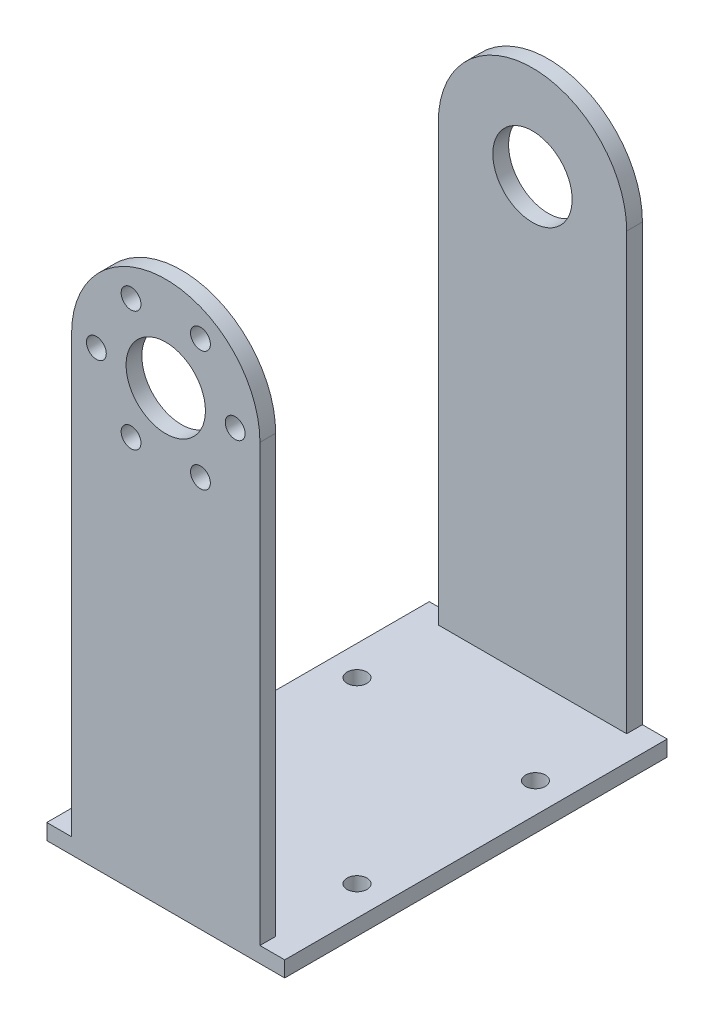
ISO-10303-21;
HEADER;
FILE_DESCRIPTION(('STEP AP214'),'2;1');
FILE_NAME('part.step','',(''),(''),'','','');
FILE_SCHEMA(('AUTOMOTIVE_DESIGN { 1 0 10303 214 1 1 1 1 }'));
ENDSEC;
DATA;
#1=APPLICATION_CONTEXT('core data for automotive mechanical design processes');
#2=APPLICATION_PROTOCOL_DEFINITION('international standard','automotive_design',2000,#1);
#3=PRODUCT_CONTEXT('',#1,'mechanical');
#4=PRODUCT('Part','Part','',(#3));
#5=PRODUCT_RELATED_PRODUCT_CATEGORY('part','',(#4));
#6=PRODUCT_DEFINITION_FORMATION('','',#4);
#7=PRODUCT_DEFINITION_CONTEXT('part definition',#1,'design');
#8=PRODUCT_DEFINITION('design','',#6,#7);
#9=PRODUCT_DEFINITION_SHAPE('','',#8);
#10=(LENGTH_UNIT() NAMED_UNIT(*) SI_UNIT(.MILLI.,.METRE.));
#11=(NAMED_UNIT(*) PLANE_ANGLE_UNIT() SI_UNIT($,.RADIAN.));
#12=(NAMED_UNIT(*) SI_UNIT($,.STERADIAN.) SOLID_ANGLE_UNIT());
#13=UNCERTAINTY_MEASURE_WITH_UNIT(LENGTH_MEASURE(1.E-05),#10,'distance_accuracy_value','');
#14=(GEOMETRIC_REPRESENTATION_CONTEXT(3) GLOBAL_UNCERTAINTY_ASSIGNED_CONTEXT((#13)) GLOBAL_UNIT_ASSIGNED_CONTEXT((#10,
#11,#12)) REPRESENTATION_CONTEXT('',''));
#15=CARTESIAN_POINT('',(0.,0.,0.));
#16=DIRECTION('',(0.,0.,1.));
#17=DIRECTION('',(1.,0.,0.));
#18=AXIS2_PLACEMENT_3D('',#15,#16,#17);
#19=CARTESIAN_POINT('',(0.,1.5875,0.));
#20=DIRECTION('',(0.,-1.,0.));
#21=DIRECTION('',(0.,0.,-1.));
#22=AXIS2_PLACEMENT_3D('',#19,#20,#21);
#23=PLANE('',#22);
#24=CARTESIAN_POINT('',(-9.,1.5875,9.));
#25=DIRECTION('',(0.,1.,0.));
#26=DIRECTION('',(0.,0.,1.));
#27=AXIS2_PLACEMENT_3D('',#24,#25,#26);
#28=CIRCLE('',#27,1.);
#29=CARTESIAN_POINT('',(-9.,1.5875,10.));
#30=VERTEX_POINT('',#29);
#31=EDGE_CURVE('E544',#30,#30,#28,.T.);
#32=ORIENTED_EDGE('',*,*,#31,.F.);
#33=EDGE_LOOP('',(#32));
#34=FACE_BOUND('',#33,.T.);
#35=CARTESIAN_POINT('',(9.,1.5875,9.));
#36=DIRECTION('',(0.,1.,0.));
#37=DIRECTION('',(0.,0.,1.));
#38=AXIS2_PLACEMENT_3D('',#35,#36,#37);
#39=CIRCLE('',#38,1.);
#40=CARTESIAN_POINT('',(9.,1.5875,10.));
#41=VERTEX_POINT('',#40);
#42=EDGE_CURVE('E546',#41,#41,#39,.T.);
#43=ORIENTED_EDGE('',*,*,#42,.F.);
#44=EDGE_LOOP('',(#43));
#45=FACE_BOUND('',#44,.T.);
#46=CARTESIAN_POINT('',(9.,1.5875,-9.));
#47=DIRECTION('',(0.,1.,0.));
#48=DIRECTION('',(0.,0.,1.));
#49=AXIS2_PLACEMENT_3D('',#46,#47,#48);
#50=CIRCLE('',#49,1.);
#51=CARTESIAN_POINT('',(9.,1.5875,-8.));
#52=VERTEX_POINT('',#51);
#53=EDGE_CURVE('E552',#52,#52,#50,.T.);
#54=ORIENTED_EDGE('',*,*,#53,.F.);
#55=EDGE_LOOP('',(#54));
#56=FACE_BOUND('',#55,.T.);
#57=CARTESIAN_POINT('',(-9.,1.5875,-9.));
#58=DIRECTION('',(0.,1.,0.));
#59=DIRECTION('',(0.,0.,1.));
#60=AXIS2_PLACEMENT_3D('',#57,#58,#59);
#61=CIRCLE('',#60,1.);
#62=CARTESIAN_POINT('',(-9.,1.5875,-8.));
#63=VERTEX_POINT('',#62);
#64=EDGE_CURVE('E558',#63,#63,#61,.T.);
#65=ORIENTED_EDGE('',*,*,#64,.F.);
#66=EDGE_LOOP('',(#65));
#67=FACE_BOUND('',#66,.T.);
#68=DIRECTION('',(1.,0.,0.));
#69=VECTOR('',#68,1.);
#70=CARTESIAN_POINT('',(0.,1.5875,-17.7025));
#71=LINE('',#70,#69);
#72=CARTESIAN_POINT('',(-9.50473763600357,1.5875,-17.7025));
#73=VERTEX_POINT('',#72);
#74=CARTESIAN_POINT('',(9.5,1.5875,-17.7025));
#75=VERTEX_POINT('',#74);
#76=EDGE_CURVE('E58',#73,#75,#71,.T.);
#77=ORIENTED_EDGE('',*,*,#76,.F.);
#78=DIRECTION('',(0.,0.,-1.));
#79=VECTOR('',#78,1.);
#80=CARTESIAN_POINT('',(-9.50473763600357,1.5875,-17.7025));
#81=LINE('',#80,#79);
#82=CARTESIAN_POINT('',(-9.50473763600357,1.5875,-19.29));
#83=VERTEX_POINT('',#82);
#84=EDGE_CURVE('E147',#73,#83,#81,.T.);
#85=ORIENTED_EDGE('',*,*,#84,.T.);
#86=DIRECTION('',(-1.,0.,0.));
#87=VECTOR('',#86,1.);
#88=CARTESIAN_POINT('',(-12.,1.5875,-19.29));
#89=LINE('',#88,#87);
#90=CARTESIAN_POINT('',(-12.,1.5875,-19.29));
#91=VERTEX_POINT('',#90);
#92=EDGE_CURVE('E296',#83,#91,#89,.T.);
#93=ORIENTED_EDGE('',*,*,#92,.T.);
#94=DIRECTION('',(0.,0.,1.));
#95=VECTOR('',#94,1.);
#96=CARTESIAN_POINT('',(-12.,1.5875,19.29));
#97=LINE('',#96,#95);
#98=CARTESIAN_POINT('',(-12.,1.5875,19.29));
#99=VERTEX_POINT('',#98);
#100=EDGE_CURVE('E255',#91,#99,#97,.T.);
#101=ORIENTED_EDGE('',*,*,#100,.T.);
#102=DIRECTION('',(1.,0.,0.));
#103=VECTOR('',#102,1.);
#104=CARTESIAN_POINT('',(-12.,1.5875,19.29));
#105=LINE('',#104,#103);
#106=CARTESIAN_POINT('',(-9.5,1.5875,19.29));
#107=VERTEX_POINT('',#106);
#108=EDGE_CURVE('E254',#99,#107,#105,.T.);
#109=ORIENTED_EDGE('',*,*,#108,.T.);
#110=DIRECTION('',(0.,0.,1.));
#111=VECTOR('',#110,1.);
#112=CARTESIAN_POINT('',(-9.5,1.5875,17.7025));
#113=LINE('',#112,#111);
#114=CARTESIAN_POINT('',(-9.5,1.5875,17.7025));
#115=VERTEX_POINT('',#114);
#116=EDGE_CURVE('E237',#115,#107,#113,.T.);
#117=ORIENTED_EDGE('',*,*,#116,.F.);
#118=DIRECTION('',(-1.,0.,0.));
#119=VECTOR('',#118,1.);
#120=CARTESIAN_POINT('',(0.,1.5875,17.7025));
#121=LINE('',#120,#119);
#122=CARTESIAN_POINT('',(9.5,1.5875,17.7025));
#123=VERTEX_POINT('',#122);
#124=EDGE_CURVE('E193',#123,#115,#121,.T.);
#125=ORIENTED_EDGE('',*,*,#124,.F.);
#126=DIRECTION('',(0.,0.,1.));
#127=VECTOR('',#126,1.);
#128=CARTESIAN_POINT('',(9.5,1.5875,17.7025));
#129=LINE('',#128,#127);
#130=CARTESIAN_POINT('',(9.5,1.5875,19.29));
#131=VERTEX_POINT('',#130);
#132=EDGE_CURVE('E229',#123,#131,#129,.T.);
#133=ORIENTED_EDGE('',*,*,#132,.T.);
#134=CARTESIAN_POINT('',(12.,1.5875,19.29));
#135=VERTEX_POINT('',#134);
#136=EDGE_CURVE('E251',#131,#135,#105,.T.);
#137=ORIENTED_EDGE('',*,*,#136,.T.);
#138=DIRECTION('',(0.,0.,-1.));
#139=VECTOR('',#138,1.);
#140=CARTESIAN_POINT('',(12.,1.5875,19.29));
#141=LINE('',#140,#139);
#142=CARTESIAN_POINT('',(12.,1.5875,-19.29));
#143=VERTEX_POINT('',#142);
#144=EDGE_CURVE('E269',#135,#143,#141,.T.);
#145=ORIENTED_EDGE('',*,*,#144,.T.);
#146=CARTESIAN_POINT('',(9.5,1.5875,-19.29));
#147=VERTEX_POINT('',#146);
#148=EDGE_CURVE('E297',#143,#147,#89,.T.);
#149=ORIENTED_EDGE('',*,*,#148,.T.);
#150=DIRECTION('',(0.,0.,-1.));
#151=VECTOR('',#150,1.);
#152=CARTESIAN_POINT('',(9.5,1.5875,-17.7025));
#153=LINE('',#152,#151);
#154=EDGE_CURVE('E53',#75,#147,#153,.T.);
#155=ORIENTED_EDGE('',*,*,#154,.F.);
#156=EDGE_LOOP('',(#77,#85,#93,#101,#109,#117,#125,#133,#137,#145,#149,#155));
#157=FACE_BOUND('',#156,.T.);
#158=ADVANCED_FACE('F36',(#34,#45,#56,#67,#157),#23,.F.);
#159=CARTESIAN_POINT('',(12.,1.5875,19.29));
#160=DIRECTION('',(-1.,0.,0.));
#161=DIRECTION('',(0.,0.,1.));
#162=AXIS2_PLACEMENT_3D('',#159,#160,#161);
#163=PLANE('',#162);
#164=DIRECTION('',(0.,0.,-1.));
#165=VECTOR('',#164,1.);
#166=CARTESIAN_POINT('',(12.,0.,19.29));
#167=LINE('',#166,#165);
#168=CARTESIAN_POINT('',(12.,0.,19.29));
#169=VERTEX_POINT('',#168);
#170=CARTESIAN_POINT('',(12.,0.,-19.29));
#171=VERTEX_POINT('',#170);
#172=EDGE_CURVE('E228',#169,#171,#167,.T.);
#173=ORIENTED_EDGE('',*,*,#172,.T.);
#174=DIRECTION('',(0.,-1.,0.));
#175=VECTOR('',#174,1.);
#176=CARTESIAN_POINT('',(12.,1.5875,-19.29));
#177=LINE('',#176,#175);
#178=EDGE_CURVE('E11',#143,#171,#177,.T.);
#179=ORIENTED_EDGE('',*,*,#178,.F.);
#180=ORIENTED_EDGE('',*,*,#144,.F.);
#181=DIRECTION('',(0.,-1.,0.));
#182=VECTOR('',#181,1.);
#183=CARTESIAN_POINT('',(12.,1.5875,19.29));
#184=LINE('',#183,#182);
#185=EDGE_CURVE('E270',#135,#169,#184,.T.);
#186=ORIENTED_EDGE('',*,*,#185,.T.);
#187=EDGE_LOOP('',(#173,#179,#180,#186));
#188=FACE_BOUND('',#187,.T.);
#189=ADVANCED_FACE('F38',(#188),#163,.F.);
#190=CARTESIAN_POINT('',(-12.,1.5875,-19.29));
#191=DIRECTION('',(0.,0.,1.));
#192=DIRECTION('',(1.,0.,0.));
#193=AXIS2_PLACEMENT_3D('',#190,#191,#192);
#194=PLANE('',#193);
#195=DIRECTION('',(-1.,0.,0.));
#196=VECTOR('',#195,1.);
#197=CARTESIAN_POINT('',(-12.,0.,-19.29));
#198=LINE('',#197,#196);
#199=CARTESIAN_POINT('',(-12.,0.,-19.29));
#200=VERTEX_POINT('',#199);
#201=EDGE_CURVE('E263',#171,#200,#198,.T.);
#202=ORIENTED_EDGE('',*,*,#201,.T.);
#203=DIRECTION('',(0.,-1.,0.));
#204=VECTOR('',#203,1.);
#205=CARTESIAN_POINT('',(-12.,1.5875,-19.29));
#206=LINE('',#205,#204);
#207=EDGE_CURVE('E45',#91,#200,#206,.T.);
#208=ORIENTED_EDGE('',*,*,#207,.F.);
#209=ORIENTED_EDGE('',*,*,#92,.F.);
#210=DIRECTION('',(0.,1.,0.));
#211=VECTOR('',#210,1.);
#212=CARTESIAN_POINT('',(-9.50473763600357,0.,-19.29));
#213=LINE('',#212,#211);
#214=CARTESIAN_POINT('',(-9.50473763600357,45.5,-19.29));
#215=VERTEX_POINT('',#214);
#216=EDGE_CURVE('E160',#83,#215,#213,.T.);
#217=ORIENTED_EDGE('',*,*,#216,.T.);
#218=CARTESIAN_POINT('',(-0.00236881800178522,45.5,-19.29));
#219=DIRECTION('',(0.,0.,-1.));
#220=DIRECTION('',(-1.,0.,0.));
#221=AXIS2_PLACEMENT_3D('',#218,#219,#220);
#222=CIRCLE('',#221,9.50236881800178);
#223=CARTESIAN_POINT('',(9.5,45.5,-19.29));
#224=VERTEX_POINT('',#223);
#225=EDGE_CURVE('E132',#215,#224,#222,.T.);
#226=ORIENTED_EDGE('',*,*,#225,.T.);
#227=DIRECTION('',(0.,1.,0.));
#228=VECTOR('',#227,1.);
#229=CARTESIAN_POINT('',(9.5,0.,-19.29));
#230=LINE('',#229,#228);
#231=EDGE_CURVE('E151',#147,#224,#230,.T.);
#232=ORIENTED_EDGE('',*,*,#231,.F.);
#233=ORIENTED_EDGE('',*,*,#148,.F.);
#234=ORIENTED_EDGE('',*,*,#178,.T.);
#235=EDGE_LOOP('',(#202,#208,#209,#217,#226,#232,#233,#234));
#236=FACE_BOUND('',#235,.T.);
#237=CARTESIAN_POINT('',(-0.00236881800178522,45.5,-19.29));
#238=DIRECTION('',(0.,0.,-1.));
#239=DIRECTION('',(-1.,0.,0.));
#240=AXIS2_PLACEMENT_3D('',#237,#238,#239);
#241=CIRCLE('',#240,4.);
#242=CARTESIAN_POINT('',(-4.00236881800179,45.5,-19.29));
#243=VERTEX_POINT('',#242);
#244=EDGE_CURVE('E157',#243,#243,#241,.T.);
#245=ORIENTED_EDGE('',*,*,#244,.F.);
#246=EDGE_LOOP('',(#245));
#247=FACE_BOUND('',#246,.T.);
#248=ADVANCED_FACE('F330',(#236,#247),#194,.F.);
#249=CARTESIAN_POINT('',(-12.,1.5875,19.29));
#250=DIRECTION('',(1.,0.,0.));
#251=DIRECTION('',(0.,0.,-1.));
#252=AXIS2_PLACEMENT_3D('',#249,#250,#251);
#253=PLANE('',#252);
#254=DIRECTION('',(0.,0.,1.));
#255=VECTOR('',#254,1.);
#256=CARTESIAN_POINT('',(-12.,0.,19.29));
#257=LINE('',#256,#255);
#258=CARTESIAN_POINT('',(-12.,0.,19.29));
#259=VERTEX_POINT('',#258);
#260=EDGE_CURVE('E265',#200,#259,#257,.T.);
#261=ORIENTED_EDGE('',*,*,#260,.T.);
#262=DIRECTION('',(0.,-1.,0.));
#263=VECTOR('',#262,1.);
#264=CARTESIAN_POINT('',(-12.,1.5875,19.29));
#265=LINE('',#264,#263);
#266=EDGE_CURVE('E273',#99,#259,#265,.T.);
#267=ORIENTED_EDGE('',*,*,#266,.F.);
#268=ORIENTED_EDGE('',*,*,#100,.F.);
#269=ORIENTED_EDGE('',*,*,#207,.T.);
#270=EDGE_LOOP('',(#261,#267,#268,#269));
#271=FACE_BOUND('',#270,.T.);
#272=ADVANCED_FACE('F281',(#271),#253,.F.);
#273=CARTESIAN_POINT('',(-12.,1.5875,19.29));
#274=DIRECTION('',(0.,0.,-1.));
#275=DIRECTION('',(-1.,0.,0.));
#276=AXIS2_PLACEMENT_3D('',#273,#274,#275);
#277=PLANE('',#276);
#278=DIRECTION('',(1.,0.,0.));
#279=VECTOR('',#278,1.);
#280=CARTESIAN_POINT('',(-12.,0.,19.29));
#281=LINE('',#280,#279);
#282=EDGE_CURVE('E267',#259,#169,#281,.T.);
#283=ORIENTED_EDGE('',*,*,#282,.T.);
#284=ORIENTED_EDGE('',*,*,#185,.F.);
#285=ORIENTED_EDGE('',*,*,#136,.F.);
#286=DIRECTION('',(0.,1.,0.));
#287=VECTOR('',#286,1.);
#288=CARTESIAN_POINT('',(9.5,0.,19.29));
#289=LINE('',#288,#287);
#290=CARTESIAN_POINT('',(9.5,45.5430013413392,19.29));
#291=VERTEX_POINT('',#290);
#292=EDGE_CURVE('E225',#131,#291,#289,.T.);
#293=ORIENTED_EDGE('',*,*,#292,.T.);
#294=CARTESIAN_POINT('',(0.,45.5430013413392,19.29));
#295=DIRECTION('',(0.,0.,1.));
#296=DIRECTION('',(1.,0.,0.));
#297=AXIS2_PLACEMENT_3D('',#294,#295,#296);
#298=CIRCLE('',#297,9.5);
#299=CARTESIAN_POINT('',(-9.5,45.5430013413392,19.29));
#300=VERTEX_POINT('',#299);
#301=EDGE_CURVE('E219',#300,#291,#298,.F.);
#302=ORIENTED_EDGE('',*,*,#301,.F.);
#303=DIRECTION('',(0.,1.,0.));
#304=VECTOR('',#303,1.);
#305=CARTESIAN_POINT('',(-9.5,0.,19.29));
#306=LINE('',#305,#304);
#307=EDGE_CURVE('E222',#107,#300,#306,.T.);
#308=ORIENTED_EDGE('',*,*,#307,.F.);
#309=ORIENTED_EDGE('',*,*,#108,.F.);
#310=ORIENTED_EDGE('',*,*,#266,.T.);
#311=EDGE_LOOP('',(#283,#284,#285,#293,#302,#308,#309,#310));
#312=FACE_BOUND('',#311,.T.);
#313=CARTESIAN_POINT('',(3.49999999999992,39.4808235148481,19.29));
#314=DIRECTION('',(0.,0.,1.));
#315=DIRECTION('',(1.,0.,0.));
#316=AXIS2_PLACEMENT_3D('',#313,#314,#315);
#317=CIRCLE('',#316,1.00000000000001);
#318=CARTESIAN_POINT('',(4.49999999999993,39.4808235148481,19.29));
#319=VERTEX_POINT('',#318);
#320=EDGE_CURVE('E167',#319,#319,#317,.T.);
#321=ORIENTED_EDGE('',*,*,#320,.F.);
#322=EDGE_LOOP('',(#321));
#323=FACE_BOUND('',#322,.T.);
#324=CARTESIAN_POINT('',(7.,45.5430013413392,19.29));
#325=DIRECTION('',(0.,0.,1.));
#326=DIRECTION('',(1.,0.,0.));
#327=AXIS2_PLACEMENT_3D('',#324,#325,#326);
#328=CIRCLE('',#327,1.);
#329=CARTESIAN_POINT('',(8.,45.5430013413392,19.29));
#330=VERTEX_POINT('',#329);
#331=EDGE_CURVE('E204',#330,#330,#328,.T.);
#332=ORIENTED_EDGE('',*,*,#331,.F.);
#333=EDGE_LOOP('',(#332));
#334=FACE_BOUND('',#333,.T.);
#335=CARTESIAN_POINT('',(3.50000000000005,51.6051791678303,19.29));
#336=DIRECTION('',(0.,0.,1.));
#337=DIRECTION('',(1.,0.,0.));
#338=AXIS2_PLACEMENT_3D('',#335,#336,#337);
#339=CIRCLE('',#338,1.);
#340=CARTESIAN_POINT('',(4.50000000000005,51.6051791678303,19.29));
#341=VERTEX_POINT('',#340);
#342=EDGE_CURVE('E207',#341,#341,#339,.T.);
#343=ORIENTED_EDGE('',*,*,#342,.F.);
#344=EDGE_LOOP('',(#343));
#345=FACE_BOUND('',#344,.T.);
#346=CARTESIAN_POINT('',(-3.49999999999997,51.6051791678303,19.29));
#347=DIRECTION('',(0.,0.,1.));
#348=DIRECTION('',(1.,0.,0.));
#349=AXIS2_PLACEMENT_3D('',#346,#347,#348);
#350=CIRCLE('',#349,1.);
#351=CARTESIAN_POINT('',(-2.49999999999997,51.6051791678303,19.29));
#352=VERTEX_POINT('',#351);
#353=EDGE_CURVE('E210',#352,#352,#350,.T.);
#354=ORIENTED_EDGE('',*,*,#353,.F.);
#355=EDGE_LOOP('',(#354));
#356=FACE_BOUND('',#355,.T.);
#357=CARTESIAN_POINT('',(-7.00000000000001,45.5430013413393,19.29));
#358=DIRECTION('',(0.,0.,1.));
#359=DIRECTION('',(1.,0.,0.));
#360=AXIS2_PLACEMENT_3D('',#357,#358,#359);
#361=CIRCLE('',#360,1.00000000000001);
#362=CARTESIAN_POINT('',(-6.,45.5430013413393,19.29));
#363=VERTEX_POINT('',#362);
#364=EDGE_CURVE('E213',#363,#363,#361,.T.);
#365=ORIENTED_EDGE('',*,*,#364,.F.);
#366=EDGE_LOOP('',(#365));
#367=FACE_BOUND('',#366,.T.);
#368=CARTESIAN_POINT('',(-3.5,39.4808235148482,19.29));
#369=DIRECTION('',(0.,0.,1.));
#370=DIRECTION('',(1.,0.,0.));
#371=AXIS2_PLACEMENT_3D('',#368,#369,#370);
#372=CIRCLE('',#371,0.999999999999999);
#373=CARTESIAN_POINT('',(-2.5,39.4808235148482,19.29));
#374=VERTEX_POINT('',#373);
#375=EDGE_CURVE('E216',#374,#374,#372,.T.);
#376=ORIENTED_EDGE('',*,*,#375,.F.);
#377=EDGE_LOOP('',(#376));
#378=FACE_BOUND('',#377,.T.);
#379=CARTESIAN_POINT('',(0.,45.5430013413392,19.29));
#380=DIRECTION('',(0.,0.,1.));
#381=DIRECTION('',(1.,0.,0.));
#382=AXIS2_PLACEMENT_3D('',#379,#380,#381);
#383=CIRCLE('',#382,4.);
#384=CARTESIAN_POINT('',(4.,45.5430013413392,19.29));
#385=VERTEX_POINT('',#384);
#386=EDGE_CURVE('E174',#385,#385,#383,.T.);
#387=ORIENTED_EDGE('',*,*,#386,.F.);
#388=EDGE_LOOP('',(#387));
#389=FACE_BOUND('',#388,.T.);
#390=ADVANCED_FACE('F289',(#312,#323,#334,#345,#356,#367,#378,#389),#277,.F.);
#391=CARTESIAN_POINT('',(0.,0.,0.));
#392=DIRECTION('',(0.,-1.,0.));
#393=DIRECTION('',(0.,0.,-1.));
#394=AXIS2_PLACEMENT_3D('',#391,#392,#393);
#395=PLANE('',#394);
#396=CARTESIAN_POINT('',(-9.,0.,9.));
#397=DIRECTION('',(0.,1.,0.));
#398=DIRECTION('',(0.,0.,1.));
#399=AXIS2_PLACEMENT_3D('',#396,#397,#398);
#400=CIRCLE('',#399,1.);
#401=CARTESIAN_POINT('',(-9.,0.,10.));
#402=VERTEX_POINT('',#401);
#403=EDGE_CURVE('E542',#402,#402,#400,.T.);
#404=ORIENTED_EDGE('',*,*,#403,.T.);
#405=EDGE_LOOP('',(#404));
#406=FACE_BOUND('',#405,.T.);
#407=CARTESIAN_POINT('',(9.,0.,9.));
#408=DIRECTION('',(0.,1.,0.));
#409=DIRECTION('',(0.,0.,1.));
#410=AXIS2_PLACEMENT_3D('',#407,#408,#409);
#411=CIRCLE('',#410,1.);
#412=CARTESIAN_POINT('',(9.,0.,10.));
#413=VERTEX_POINT('',#412);
#414=EDGE_CURVE('E549',#413,#413,#411,.T.);
#415=ORIENTED_EDGE('',*,*,#414,.T.);
#416=EDGE_LOOP('',(#415));
#417=FACE_BOUND('',#416,.T.);
#418=CARTESIAN_POINT('',(9.,0.,-9.));
#419=DIRECTION('',(0.,1.,0.));
#420=DIRECTION('',(0.,0.,1.));
#421=AXIS2_PLACEMENT_3D('',#418,#419,#420);
#422=CIRCLE('',#421,1.);
#423=CARTESIAN_POINT('',(9.,0.,-8.));
#424=VERTEX_POINT('',#423);
#425=EDGE_CURVE('E555',#424,#424,#422,.T.);
#426=ORIENTED_EDGE('',*,*,#425,.T.);
#427=EDGE_LOOP('',(#426));
#428=FACE_BOUND('',#427,.T.);
#429=CARTESIAN_POINT('',(-9.,0.,-9.));
#430=DIRECTION('',(0.,1.,0.));
#431=DIRECTION('',(0.,0.,1.));
#432=AXIS2_PLACEMENT_3D('',#429,#430,#431);
#433=CIRCLE('',#432,1.);
#434=CARTESIAN_POINT('',(-9.,0.,-8.));
#435=VERTEX_POINT('',#434);
#436=EDGE_CURVE('E161',#435,#435,#433,.T.);
#437=ORIENTED_EDGE('',*,*,#436,.T.);
#438=EDGE_LOOP('',(#437));
#439=FACE_BOUND('',#438,.T.);
#440=ORIENTED_EDGE('',*,*,#172,.F.);
#441=ORIENTED_EDGE('',*,*,#282,.F.);
#442=ORIENTED_EDGE('',*,*,#260,.F.);
#443=ORIENTED_EDGE('',*,*,#201,.F.);
#444=EDGE_LOOP('',(#440,#441,#442,#443));
#445=FACE_BOUND('',#444,.T.);
#446=ADVANCED_FACE('F287',(#406,#417,#428,#439,#445),#395,.T.);
#447=CARTESIAN_POINT('',(0.,45.5430013413392,17.7025));
#448=DIRECTION('',(0.,0.,1.));
#449=DIRECTION('',(1.,0.,0.));
#450=AXIS2_PLACEMENT_3D('',#447,#448,#449);
#451=CYLINDRICAL_SURFACE('',#450,9.5);
#452=ORIENTED_EDGE('',*,*,#301,.T.);
#453=DIRECTION('',(0.,0.,1.));
#454=VECTOR('',#453,1.);
#455=CARTESIAN_POINT('',(9.5,45.5430013413392,17.7025));
#456=LINE('',#455,#454);
#457=CARTESIAN_POINT('',(9.5,45.5430013413392,17.7025));
#458=VERTEX_POINT('',#457);
#459=EDGE_CURVE('E226',#458,#291,#456,.T.);
#460=ORIENTED_EDGE('',*,*,#459,.F.);
#461=CARTESIAN_POINT('',(0.,45.5430013413392,17.7025));
#462=DIRECTION('',(0.,0.,1.));
#463=DIRECTION('',(1.,0.,0.));
#464=AXIS2_PLACEMENT_3D('',#461,#462,#463);
#465=CIRCLE('',#464,9.5);
#466=CARTESIAN_POINT('',(-9.5,45.5430013413392,17.7025));
#467=VERTEX_POINT('',#466);
#468=EDGE_CURVE('E189',#467,#458,#465,.F.);
#469=ORIENTED_EDGE('',*,*,#468,.F.);
#470=DIRECTION('',(0.,0.,1.));
#471=VECTOR('',#470,1.);
#472=CARTESIAN_POINT('',(-9.5,45.5430013413392,17.7025));
#473=LINE('',#472,#471);
#474=EDGE_CURVE('E201',#467,#300,#473,.T.);
#475=ORIENTED_EDGE('',*,*,#474,.T.);
#476=EDGE_LOOP('',(#452,#460,#469,#475));
#477=FACE_BOUND('',#476,.T.);
#478=ADVANCED_FACE('F303',(#477),#451,.T.);
#479=CARTESIAN_POINT('',(9.5,0.,17.7025));
#480=DIRECTION('',(1.,0.,0.));
#481=DIRECTION('',(0.,0.,-1.));
#482=AXIS2_PLACEMENT_3D('',#479,#480,#481);
#483=PLANE('',#482);
#484=ORIENTED_EDGE('',*,*,#292,.F.);
#485=ORIENTED_EDGE('',*,*,#132,.F.);
#486=DIRECTION('',(0.,1.,0.));
#487=VECTOR('',#486,1.);
#488=CARTESIAN_POINT('',(9.5,0.,17.7025));
#489=LINE('',#488,#487);
#490=EDGE_CURVE('E195',#123,#458,#489,.T.);
#491=ORIENTED_EDGE('',*,*,#490,.T.);
#492=ORIENTED_EDGE('',*,*,#459,.T.);
#493=EDGE_LOOP('',(#484,#485,#491,#492));
#494=FACE_BOUND('',#493,.T.);
#495=ADVANCED_FACE('F313',(#494),#483,.T.);
#496=CARTESIAN_POINT('',(-9.5,0.,17.7025));
#497=DIRECTION('',(1.,0.,0.));
#498=DIRECTION('',(0.,0.,-1.));
#499=AXIS2_PLACEMENT_3D('',#496,#497,#498);
#500=PLANE('',#499);
#501=ORIENTED_EDGE('',*,*,#307,.T.);
#502=ORIENTED_EDGE('',*,*,#474,.F.);
#503=DIRECTION('',(0.,1.,0.));
#504=VECTOR('',#503,1.);
#505=CARTESIAN_POINT('',(-9.5,0.,17.7025));
#506=LINE('',#505,#504);
#507=EDGE_CURVE('E191',#115,#467,#506,.T.);
#508=ORIENTED_EDGE('',*,*,#507,.F.);
#509=ORIENTED_EDGE('',*,*,#116,.T.);
#510=EDGE_LOOP('',(#501,#502,#508,#509));
#511=FACE_BOUND('',#510,.T.);
#512=ADVANCED_FACE('F306',(#511),#500,.F.);
#513=CARTESIAN_POINT('',(-3.5,39.4808235148482,17.7025));
#514=DIRECTION('',(0.,0.,1.));
#515=DIRECTION('',(1.,0.,0.));
#516=AXIS2_PLACEMENT_3D('',#513,#514,#515);
#517=CYLINDRICAL_SURFACE('',#516,0.999999999999999);
#518=CARTESIAN_POINT('',(-3.5,39.4808235148482,17.7025));
#519=DIRECTION('',(0.,0.,1.));
#520=DIRECTION('',(1.,0.,0.));
#521=AXIS2_PLACEMENT_3D('',#518,#519,#520);
#522=CIRCLE('',#521,0.999999999999999);
#523=CARTESIAN_POINT('',(-2.5,39.4808235148482,17.7025));
#524=VERTEX_POINT('',#523);
#525=EDGE_CURVE('E186',#524,#524,#522,.T.);
#526=ORIENTED_EDGE('',*,*,#525,.F.);
#527=EDGE_LOOP('',(#526));
#528=FACE_BOUND('',#527,.T.);
#529=ORIENTED_EDGE('',*,*,#375,.T.);
#530=EDGE_LOOP('',(#529));
#531=FACE_BOUND('',#530,.T.);
#532=ADVANCED_FACE('F320',(#528,#531),#517,.F.);
#533=CARTESIAN_POINT('',(-7.00000000000001,45.5430013413393,17.7025));
#534=DIRECTION('',(0.,0.,1.));
#535=DIRECTION('',(1.,0.,0.));
#536=AXIS2_PLACEMENT_3D('',#533,#534,#535);
#537=CYLINDRICAL_SURFACE('',#536,1.00000000000001);
#538=CARTESIAN_POINT('',(-7.00000000000001,45.5430013413393,17.7025));
#539=DIRECTION('',(0.,0.,1.));
#540=DIRECTION('',(1.,0.,0.));
#541=AXIS2_PLACEMENT_3D('',#538,#539,#540);
#542=CIRCLE('',#541,1.00000000000001);
#543=CARTESIAN_POINT('',(-6.,45.5430013413393,17.7025));
#544=VERTEX_POINT('',#543);
#545=EDGE_CURVE('E183',#544,#544,#542,.T.);
#546=ORIENTED_EDGE('',*,*,#545,.F.);
#547=EDGE_LOOP('',(#546));
#548=FACE_BOUND('',#547,.T.);
#549=ORIENTED_EDGE('',*,*,#364,.T.);
#550=EDGE_LOOP('',(#549));
#551=FACE_BOUND('',#550,.T.);
#552=ADVANCED_FACE('F398',(#548,#551),#537,.F.);
#553=CARTESIAN_POINT('',(-3.49999999999997,51.6051791678303,17.7025));
#554=DIRECTION('',(0.,0.,1.));
#555=DIRECTION('',(1.,0.,0.));
#556=AXIS2_PLACEMENT_3D('',#553,#554,#555);
#557=CYLINDRICAL_SURFACE('',#556,1.);
#558=CARTESIAN_POINT('',(-3.49999999999997,51.6051791678303,17.7025));
#559=DIRECTION('',(0.,0.,1.));
#560=DIRECTION('',(1.,0.,0.));
#561=AXIS2_PLACEMENT_3D('',#558,#559,#560);
#562=CIRCLE('',#561,1.);
#563=CARTESIAN_POINT('',(-2.49999999999997,51.6051791678303,17.7025));
#564=VERTEX_POINT('',#563);
#565=EDGE_CURVE('E180',#564,#564,#562,.T.);
#566=ORIENTED_EDGE('',*,*,#565,.F.);
#567=EDGE_LOOP('',(#566));
#568=FACE_BOUND('',#567,.T.);
#569=ORIENTED_EDGE('',*,*,#353,.T.);
#570=EDGE_LOOP('',(#569));
#571=FACE_BOUND('',#570,.T.);
#572=ADVANCED_FACE('F404',(#568,#571),#557,.F.);
#573=CARTESIAN_POINT('',(3.50000000000005,51.6051791678303,17.7025));
#574=DIRECTION('',(0.,0.,1.));
#575=DIRECTION('',(1.,0.,0.));
#576=AXIS2_PLACEMENT_3D('',#573,#574,#575);
#577=CYLINDRICAL_SURFACE('',#576,1.);
#578=CARTESIAN_POINT('',(3.50000000000005,51.6051791678303,17.7025));
#579=DIRECTION('',(0.,0.,1.));
#580=DIRECTION('',(1.,0.,0.));
#581=AXIS2_PLACEMENT_3D('',#578,#579,#580);
#582=CIRCLE('',#581,1.);
#583=CARTESIAN_POINT('',(4.50000000000005,51.6051791678303,17.7025));
#584=VERTEX_POINT('',#583);
#585=EDGE_CURVE('E177',#584,#584,#582,.T.);
#586=ORIENTED_EDGE('',*,*,#585,.F.);
#587=EDGE_LOOP('',(#586));
#588=FACE_BOUND('',#587,.T.);
#589=ORIENTED_EDGE('',*,*,#342,.T.);
#590=EDGE_LOOP('',(#589));
#591=FACE_BOUND('',#590,.T.);
#592=ADVANCED_FACE('F381',(#588,#591),#577,.F.);
#593=CARTESIAN_POINT('',(7.,45.5430013413392,17.7025));
#594=DIRECTION('',(0.,0.,1.));
#595=DIRECTION('',(1.,0.,0.));
#596=AXIS2_PLACEMENT_3D('',#593,#594,#595);
#597=CYLINDRICAL_SURFACE('',#596,1.);
#598=CARTESIAN_POINT('',(7.,45.5430013413392,17.7025));
#599=DIRECTION('',(0.,0.,1.));
#600=DIRECTION('',(1.,0.,0.));
#601=AXIS2_PLACEMENT_3D('',#598,#599,#600);
#602=CIRCLE('',#601,1.);
#603=CARTESIAN_POINT('',(8.,45.5430013413392,17.7025));
#604=VERTEX_POINT('',#603);
#605=EDGE_CURVE('E173',#604,#604,#602,.T.);
#606=ORIENTED_EDGE('',*,*,#605,.F.);
#607=EDGE_LOOP('',(#606));
#608=FACE_BOUND('',#607,.T.);
#609=ORIENTED_EDGE('',*,*,#331,.T.);
#610=EDGE_LOOP('',(#609));
#611=FACE_BOUND('',#610,.T.);
#612=ADVANCED_FACE('F372',(#608,#611),#597,.F.);
#613=CARTESIAN_POINT('',(3.49999999999992,39.4808235148481,17.7025));
#614=DIRECTION('',(0.,0.,1.));
#615=DIRECTION('',(1.,0.,0.));
#616=AXIS2_PLACEMENT_3D('',#613,#614,#615);
#617=CYLINDRICAL_SURFACE('',#616,1.00000000000001);
#618=CARTESIAN_POINT('',(3.49999999999992,39.4808235148481,17.7025));
#619=DIRECTION('',(0.,0.,1.));
#620=DIRECTION('',(1.,0.,0.));
#621=AXIS2_PLACEMENT_3D('',#618,#619,#620);
#622=CIRCLE('',#621,1.00000000000001);
#623=CARTESIAN_POINT('',(4.49999999999993,39.4808235148481,17.7025));
#624=VERTEX_POINT('',#623);
#625=EDGE_CURVE('E170',#624,#624,#622,.T.);
#626=ORIENTED_EDGE('',*,*,#625,.F.);
#627=EDGE_LOOP('',(#626));
#628=FACE_BOUND('',#627,.T.);
#629=ORIENTED_EDGE('',*,*,#320,.T.);
#630=EDGE_LOOP('',(#629));
#631=FACE_BOUND('',#630,.T.);
#632=ADVANCED_FACE('F335',(#628,#631),#617,.F.);
#633=CARTESIAN_POINT('',(0.,45.5430013413392,17.7025));
#634=DIRECTION('',(0.,0.,1.));
#635=DIRECTION('',(1.,0.,0.));
#636=AXIS2_PLACEMENT_3D('',#633,#634,#635);
#637=CYLINDRICAL_SURFACE('',#636,4.);
#638=CARTESIAN_POINT('',(0.,45.5430013413392,17.7025));
#639=DIRECTION('',(0.,0.,1.));
#640=DIRECTION('',(1.,0.,0.));
#641=AXIS2_PLACEMENT_3D('',#638,#639,#640);
#642=CIRCLE('',#641,4.);
#643=CARTESIAN_POINT('',(4.,45.5430013413392,17.7025));
#644=VERTEX_POINT('',#643);
#645=EDGE_CURVE('E198',#644,#644,#642,.T.);
#646=ORIENTED_EDGE('',*,*,#645,.F.);
#647=EDGE_LOOP('',(#646));
#648=FACE_BOUND('',#647,.T.);
#649=ORIENTED_EDGE('',*,*,#386,.T.);
#650=EDGE_LOOP('',(#649));
#651=FACE_BOUND('',#650,.T.);
#652=ADVANCED_FACE('F365',(#648,#651),#637,.F.);
#653=CARTESIAN_POINT('',(0.,0.,17.7025));
#654=DIRECTION('',(0.,0.,1.));
#655=DIRECTION('',(1.,0.,0.));
#656=AXIS2_PLACEMENT_3D('',#653,#654,#655);
#657=PLANE('',#656);
#658=ORIENTED_EDGE('',*,*,#625,.T.);
#659=EDGE_LOOP('',(#658));
#660=FACE_BOUND('',#659,.T.);
#661=ORIENTED_EDGE('',*,*,#605,.T.);
#662=EDGE_LOOP('',(#661));
#663=FACE_BOUND('',#662,.T.);
#664=ORIENTED_EDGE('',*,*,#585,.T.);
#665=EDGE_LOOP('',(#664));
#666=FACE_BOUND('',#665,.T.);
#667=ORIENTED_EDGE('',*,*,#565,.T.);
#668=EDGE_LOOP('',(#667));
#669=FACE_BOUND('',#668,.T.);
#670=ORIENTED_EDGE('',*,*,#545,.T.);
#671=EDGE_LOOP('',(#670));
#672=FACE_BOUND('',#671,.T.);
#673=ORIENTED_EDGE('',*,*,#525,.T.);
#674=EDGE_LOOP('',(#673));
#675=FACE_BOUND('',#674,.T.);
#676=ORIENTED_EDGE('',*,*,#468,.T.);
#677=ORIENTED_EDGE('',*,*,#490,.F.);
#678=ORIENTED_EDGE('',*,*,#124,.T.);
#679=ORIENTED_EDGE('',*,*,#507,.T.);
#680=EDGE_LOOP('',(#676,#677,#678,#679));
#681=FACE_BOUND('',#680,.T.);
#682=ORIENTED_EDGE('',*,*,#645,.T.);
#683=EDGE_LOOP('',(#682));
#684=FACE_BOUND('',#683,.T.);
#685=ADVANCED_FACE('F310',(#660,#663,#666,#669,#672,#675,#681,#684),#657,.F.);
#686=CARTESIAN_POINT('',(-9.50473763600357,0.,-17.7025));
#687=DIRECTION('',(-1.,0.,0.));
#688=DIRECTION('',(0.,0.,1.));
#689=AXIS2_PLACEMENT_3D('',#686,#687,#688);
#690=PLANE('',#689);
#691=ORIENTED_EDGE('',*,*,#216,.F.);
#692=ORIENTED_EDGE('',*,*,#84,.F.);
#693=DIRECTION('',(0.,1.,0.));
#694=VECTOR('',#693,1.);
#695=CARTESIAN_POINT('',(-9.50473763600357,0.,-17.7025));
#696=LINE('',#695,#694);
#697=CARTESIAN_POINT('',(-9.50473763600357,45.5,-17.7025));
#698=VERTEX_POINT('',#697);
#699=EDGE_CURVE('E142',#73,#698,#696,.T.);
#700=ORIENTED_EDGE('',*,*,#699,.T.);
#701=DIRECTION('',(0.,0.,-1.));
#702=VECTOR('',#701,1.);
#703=CARTESIAN_POINT('',(-9.50473763600357,45.5,-17.7025));
#704=LINE('',#703,#702);
#705=EDGE_CURVE('E127',#698,#215,#704,.T.);
#706=ORIENTED_EDGE('',*,*,#705,.T.);
#707=EDGE_LOOP('',(#691,#692,#700,#706));
#708=FACE_BOUND('',#707,.T.);
#709=ADVANCED_FACE('F146',(#708),#690,.T.);
#710=CARTESIAN_POINT('',(9.5,0.,-17.7025));
#711=DIRECTION('',(-1.,0.,0.));
#712=DIRECTION('',(0.,0.,1.));
#713=AXIS2_PLACEMENT_3D('',#710,#711,#712);
#714=PLANE('',#713);
#715=ORIENTED_EDGE('',*,*,#231,.T.);
#716=DIRECTION('',(0.,0.,-1.));
#717=VECTOR('',#716,1.);
#718=CARTESIAN_POINT('',(9.5,45.5,-17.7025));
#719=LINE('',#718,#717);
#720=CARTESIAN_POINT('',(9.5,45.5,-17.7025));
#721=VERTEX_POINT('',#720);
#722=EDGE_CURVE('E137',#721,#224,#719,.T.);
#723=ORIENTED_EDGE('',*,*,#722,.F.);
#724=DIRECTION('',(0.,1.,0.));
#725=VECTOR('',#724,1.);
#726=CARTESIAN_POINT('',(9.5,0.,-17.7025));
#727=LINE('',#726,#725);
#728=EDGE_CURVE('E143',#75,#721,#727,.T.);
#729=ORIENTED_EDGE('',*,*,#728,.F.);
#730=ORIENTED_EDGE('',*,*,#154,.T.);
#731=EDGE_LOOP('',(#715,#723,#729,#730));
#732=FACE_BOUND('',#731,.T.);
#733=ADVANCED_FACE('F351',(#732),#714,.F.);
#734=CARTESIAN_POINT('',(-0.00236881800178522,45.5,-17.7025));
#735=DIRECTION('',(0.,0.,-1.));
#736=DIRECTION('',(-1.,0.,0.));
#737=AXIS2_PLACEMENT_3D('',#734,#735,#736);
#738=CYLINDRICAL_SURFACE('',#737,4.);
#739=CARTESIAN_POINT('',(-0.00236881800178522,45.5,-17.7025));
#740=DIRECTION('',(0.,0.,-1.));
#741=DIRECTION('',(-1.,0.,0.));
#742=AXIS2_PLACEMENT_3D('',#739,#740,#741);
#743=CIRCLE('',#742,4.);
#744=CARTESIAN_POINT('',(-4.00236881800179,45.5,-17.7025));
#745=VERTEX_POINT('',#744);
#746=EDGE_CURVE('E148',#745,#745,#743,.T.);
#747=ORIENTED_EDGE('',*,*,#746,.F.);
#748=EDGE_LOOP('',(#747));
#749=FACE_BOUND('',#748,.T.);
#750=ORIENTED_EDGE('',*,*,#244,.T.);
#751=EDGE_LOOP('',(#750));
#752=FACE_BOUND('',#751,.T.);
#753=ADVANCED_FACE('F349',(#749,#752),#738,.F.);
#754=CARTESIAN_POINT('',(-0.00236881800178522,45.5,-17.7025));
#755=DIRECTION('',(0.,0.,-1.));
#756=DIRECTION('',(-1.,0.,0.));
#757=AXIS2_PLACEMENT_3D('',#754,#755,#756);
#758=CYLINDRICAL_SURFACE('',#757,9.50236881800178);
#759=ORIENTED_EDGE('',*,*,#225,.F.);
#760=ORIENTED_EDGE('',*,*,#705,.F.);
#761=CARTESIAN_POINT('',(-0.00236881800178522,45.5,-17.7025));
#762=DIRECTION('',(0.,0.,-1.));
#763=DIRECTION('',(-1.,0.,0.));
#764=AXIS2_PLACEMENT_3D('',#761,#762,#763);
#765=CIRCLE('',#764,9.50236881800178);
#766=EDGE_CURVE('E130',#698,#721,#765,.T.);
#767=ORIENTED_EDGE('',*,*,#766,.T.);
#768=ORIENTED_EDGE('',*,*,#722,.T.);
#769=EDGE_LOOP('',(#759,#760,#767,#768));
#770=FACE_BOUND('',#769,.T.);
#771=ADVANCED_FACE('F129',(#770),#758,.T.);
#772=CARTESIAN_POINT('',(0.,0.,-17.7025));
#773=DIRECTION('',(0.,0.,-1.));
#774=DIRECTION('',(-1.,0.,0.));
#775=AXIS2_PLACEMENT_3D('',#772,#773,#774);
#776=PLANE('',#775);
#777=ORIENTED_EDGE('',*,*,#746,.T.);
#778=EDGE_LOOP('',(#777));
#779=FACE_BOUND('',#778,.T.);
#780=ORIENTED_EDGE('',*,*,#699,.F.);
#781=ORIENTED_EDGE('',*,*,#76,.T.);
#782=ORIENTED_EDGE('',*,*,#728,.T.);
#783=ORIENTED_EDGE('',*,*,#766,.F.);
#784=EDGE_LOOP('',(#780,#781,#782,#783));
#785=FACE_BOUND('',#784,.T.);
#786=ADVANCED_FACE('F141',(#779,#785),#776,.F.);
#787=CARTESIAN_POINT('',(-9.,0.,-9.));
#788=DIRECTION('',(0.,1.,0.));
#789=DIRECTION('',(0.,0.,1.));
#790=AXIS2_PLACEMENT_3D('',#787,#788,#789);
#791=CYLINDRICAL_SURFACE('',#790,1.);
#792=ORIENTED_EDGE('',*,*,#436,.F.);
#793=EDGE_LOOP('',(#792));
#794=FACE_BOUND('',#793,.T.);
#795=ORIENTED_EDGE('',*,*,#64,.T.);
#796=EDGE_LOOP('',(#795));
#797=FACE_BOUND('',#796,.T.);
#798=ADVANCED_FACE('F482',(#794,#797),#791,.F.);
#799=CARTESIAN_POINT('',(9.,0.,-9.));
#800=DIRECTION('',(0.,1.,0.));
#801=DIRECTION('',(0.,0.,1.));
#802=AXIS2_PLACEMENT_3D('',#799,#800,#801);
#803=CYLINDRICAL_SURFACE('',#802,1.);
#804=ORIENTED_EDGE('',*,*,#425,.F.);
#805=EDGE_LOOP('',(#804));
#806=FACE_BOUND('',#805,.T.);
#807=ORIENTED_EDGE('',*,*,#53,.T.);
#808=EDGE_LOOP('',(#807));
#809=FACE_BOUND('',#808,.T.);
#810=ADVANCED_FACE('F505',(#806,#809),#803,.F.);
#811=CARTESIAN_POINT('',(9.,0.,9.));
#812=DIRECTION('',(0.,1.,0.));
#813=DIRECTION('',(0.,0.,1.));
#814=AXIS2_PLACEMENT_3D('',#811,#812,#813);
#815=CYLINDRICAL_SURFACE('',#814,1.);
#816=ORIENTED_EDGE('',*,*,#414,.F.);
#817=EDGE_LOOP('',(#816));
#818=FACE_BOUND('',#817,.T.);
#819=ORIENTED_EDGE('',*,*,#42,.T.);
#820=EDGE_LOOP('',(#819));
#821=FACE_BOUND('',#820,.T.);
#822=ADVANCED_FACE('F515',(#818,#821),#815,.F.);
#823=CARTESIAN_POINT('',(-9.,0.,9.));
#824=DIRECTION('',(0.,1.,0.));
#825=DIRECTION('',(0.,0.,1.));
#826=AXIS2_PLACEMENT_3D('',#823,#824,#825);
#827=CYLINDRICAL_SURFACE('',#826,1.);
#828=ORIENTED_EDGE('',*,*,#403,.F.);
#829=EDGE_LOOP('',(#828));
#830=FACE_BOUND('',#829,.T.);
#831=ORIENTED_EDGE('',*,*,#31,.T.);
#832=EDGE_LOOP('',(#831));
#833=FACE_BOUND('',#832,.T.);
#834=ADVANCED_FACE('F525',(#830,#833),#827,.F.);
#835=CLOSED_SHELL('',(#158,#189,#248,#272,#390,#446,#478,#495,#512,#532,#552,#572,#592,#612,
#632,#652,#685,#709,#733,#753,#771,#786,#798,#810,#822,#834));
#836=MANIFOLD_SOLID_BREP('B2',#835);
#837=ADVANCED_BREP_SHAPE_REPRESENTATION('',(#18,#836),#14);
#838=SHAPE_DEFINITION_REPRESENTATION(#9,#837);
ENDSEC;
END-ISO-10303-21;
